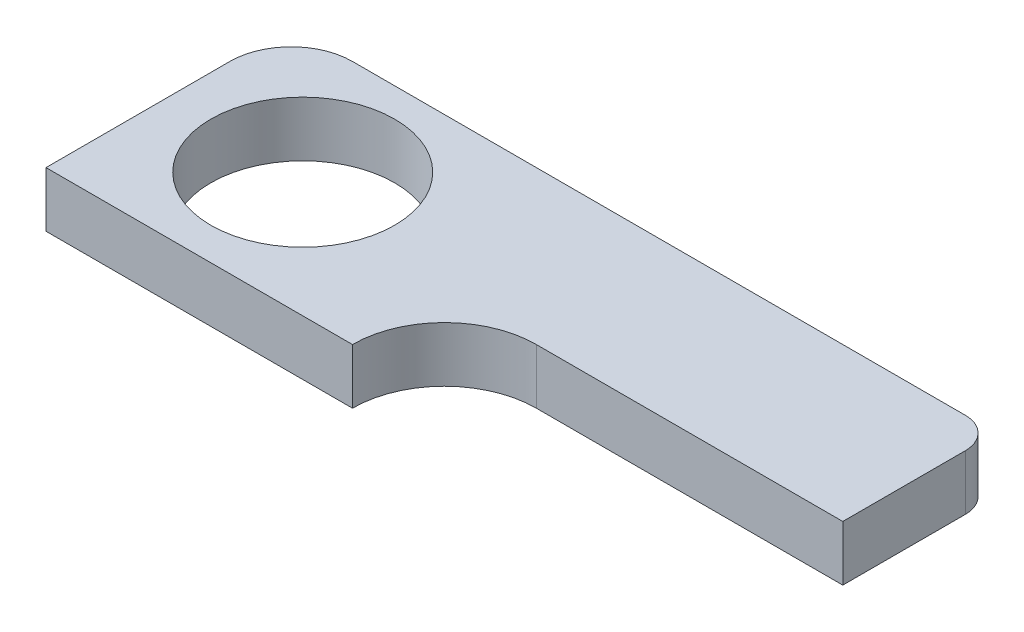
ISO-10303-21;
HEADER;
FILE_DESCRIPTION(('STEP AP214'),'2;1');
FILE_NAME('part.step','',(''),(''),'','','');
FILE_SCHEMA(('AUTOMOTIVE_DESIGN { 1 0 10303 214 1 1 1 1 }'));
ENDSEC;
DATA;
#1=APPLICATION_CONTEXT('core data for automotive mechanical design processes');
#2=APPLICATION_PROTOCOL_DEFINITION('international standard','automotive_design',2000,#1);
#3=PRODUCT_CONTEXT('',#1,'mechanical');
#4=PRODUCT('Part','Part','',(#3));
#5=PRODUCT_RELATED_PRODUCT_CATEGORY('part','',(#4));
#6=PRODUCT_DEFINITION_FORMATION('','',#4);
#7=PRODUCT_DEFINITION_CONTEXT('part definition',#1,'design');
#8=PRODUCT_DEFINITION('design','',#6,#7);
#9=PRODUCT_DEFINITION_SHAPE('','',#8);
#10=(LENGTH_UNIT() NAMED_UNIT(*) SI_UNIT(.MILLI.,.METRE.));
#11=(NAMED_UNIT(*) PLANE_ANGLE_UNIT() SI_UNIT($,.RADIAN.));
#12=(NAMED_UNIT(*) SI_UNIT($,.STERADIAN.) SOLID_ANGLE_UNIT());
#13=UNCERTAINTY_MEASURE_WITH_UNIT(LENGTH_MEASURE(1.E-05),#10,'distance_accuracy_value','');
#14=(GEOMETRIC_REPRESENTATION_CONTEXT(3) GLOBAL_UNCERTAINTY_ASSIGNED_CONTEXT((#13)) GLOBAL_UNIT_ASSIGNED_CONTEXT((#10,
#11,#12)) REPRESENTATION_CONTEXT('',''));
#15=CARTESIAN_POINT('',(0.,0.,0.));
#16=DIRECTION('',(0.,0.,1.));
#17=DIRECTION('',(1.,0.,0.));
#18=AXIS2_PLACEMENT_3D('',#15,#16,#17);
#19=CARTESIAN_POINT('',(220.,0.,-90.));
#20=DIRECTION('',(0.,1.,0.));
#21=DIRECTION('',(0.,0.,1.));
#22=AXIS2_PLACEMENT_3D('',#19,#20,#21);
#23=PLANE('',#22);
#24=CARTESIAN_POINT('',(43.1852937481381,0.,-60.5873975964926));
#25=DIRECTION('',(0.,-1.,0.));
#26=DIRECTION('',(0.,0.,-1.));
#27=AXIS2_PLACEMENT_3D('',#24,#25,#26);
#28=CIRCLE('',#27,30.);
#29=CARTESIAN_POINT('',(43.1852937481381,0.,-90.5873975964926));
#30=VERTEX_POINT('',#29);
#31=EDGE_CURVE('E109',#30,#30,#28,.F.);
#32=ORIENTED_EDGE('',*,*,#31,.T.);
#33=EDGE_LOOP('',(#32));
#34=FACE_BOUND('',#33,.T.);
#35=DIRECTION('',(-1.,0.,0.));
#36=VECTOR('',#35,1.);
#37=CARTESIAN_POINT('',(130.,0.,-50.));
#38=LINE('',#37,#36);
#39=CARTESIAN_POINT('',(230.,0.,-50.));
#40=VERTEX_POINT('',#39);
#41=CARTESIAN_POINT('',(130.,0.,-50.));
#42=VERTEX_POINT('',#41);
#43=EDGE_CURVE('E106',#40,#42,#38,.T.);
#44=ORIENTED_EDGE('',*,*,#43,.T.);
#45=CARTESIAN_POINT('',(130.,0.,-20.));
#46=DIRECTION('',(0.,-1.,0.));
#47=DIRECTION('',(0.,0.,-1.));
#48=AXIS2_PLACEMENT_3D('',#45,#46,#47);
#49=CIRCLE('',#48,30.);
#50=CARTESIAN_POINT('',(100.,0.,-19.9999999999998));
#51=VERTEX_POINT('',#50);
#52=EDGE_CURVE('E148',#42,#51,#49,.F.);
#53=ORIENTED_EDGE('',*,*,#52,.T.);
#54=DIRECTION('',(-1.,0.,0.));
#55=VECTOR('',#54,1.);
#56=CARTESIAN_POINT('',(100.,0.,-19.9999999999998));
#57=LINE('',#56,#55);
#58=CARTESIAN_POINT('',(0.,0.,-20.));
#59=VERTEX_POINT('',#58);
#60=EDGE_CURVE('E117',#51,#59,#57,.T.);
#61=ORIENTED_EDGE('',*,*,#60,.T.);
#62=DIRECTION('',(0.,0.,-1.));
#63=VECTOR('',#62,1.);
#64=CARTESIAN_POINT('',(0.,0.,-79.9999999999999));
#65=LINE('',#64,#63);
#66=CARTESIAN_POINT('',(0.,0.,-79.9999999999999));
#67=VERTEX_POINT('',#66);
#68=EDGE_CURVE('E125',#59,#67,#65,.T.);
#69=ORIENTED_EDGE('',*,*,#68,.T.);
#70=CARTESIAN_POINT('',(20.,0.,-80.));
#71=DIRECTION('',(0.,-1.,0.));
#72=DIRECTION('',(0.,0.,-1.));
#73=AXIS2_PLACEMENT_3D('',#70,#71,#72);
#74=CIRCLE('',#73,20.);
#75=CARTESIAN_POINT('',(20.,0.,-100.));
#76=VERTEX_POINT('',#75);
#77=EDGE_CURVE('E88',#76,#67,#74,.F.);
#78=ORIENTED_EDGE('',*,*,#77,.F.);
#79=DIRECTION('',(1.,0.,0.));
#80=VECTOR('',#79,1.);
#81=CARTESIAN_POINT('',(20.0000000000001,0.,-100.));
#82=LINE('',#81,#80);
#83=CARTESIAN_POINT('',(220.,0.,-100.));
#84=VERTEX_POINT('',#83);
#85=EDGE_CURVE('E85',#76,#84,#82,.T.);
#86=ORIENTED_EDGE('',*,*,#85,.T.);
#87=CARTESIAN_POINT('',(220.,0.,-90.));
#88=DIRECTION('',(0.,-1.,0.));
#89=DIRECTION('',(0.,0.,-1.));
#90=AXIS2_PLACEMENT_3D('',#87,#88,#89);
#91=CIRCLE('',#90,9.99999999999999);
#92=CARTESIAN_POINT('',(230.,0.,-90.));
#93=VERTEX_POINT('',#92);
#94=EDGE_CURVE('E19',#93,#84,#91,.F.);
#95=ORIENTED_EDGE('',*,*,#94,.F.);
#96=DIRECTION('',(0.,0.,1.));
#97=VECTOR('',#96,1.);
#98=CARTESIAN_POINT('',(230.,0.,-50.));
#99=LINE('',#98,#97);
#100=EDGE_CURVE('E83',#93,#40,#99,.T.);
#101=ORIENTED_EDGE('',*,*,#100,.T.);
#102=EDGE_LOOP('',(#44,#53,#61,#69,#78,#86,#95,#101));
#103=FACE_BOUND('',#102,.T.);
#104=ADVANCED_FACE('F16',(#34,#103),#23,.F.);
#105=CARTESIAN_POINT('',(230.,18.,-50.));
#106=DIRECTION('',(-1.,0.,0.));
#107=DIRECTION('',(0.,0.,1.));
#108=AXIS2_PLACEMENT_3D('',#105,#106,#107);
#109=PLANE('',#108);
#110=DIRECTION('',(0.,-1.,0.));
#111=VECTOR('',#110,1.);
#112=CARTESIAN_POINT('',(230.,18.,-89.9999999999999));
#113=LINE('',#112,#111);
#114=CARTESIAN_POINT('',(230.,18.,-90.));
#115=VERTEX_POINT('',#114);
#116=EDGE_CURVE('E81',#115,#93,#113,.T.);
#117=ORIENTED_EDGE('',*,*,#116,.F.);
#118=DIRECTION('',(0.,0.,1.));
#119=VECTOR('',#118,1.);
#120=CARTESIAN_POINT('',(230.,18.,-90.));
#121=LINE('',#120,#119);
#122=CARTESIAN_POINT('',(230.,18.,-50.));
#123=VERTEX_POINT('',#122);
#124=EDGE_CURVE('E144',#123,#115,#121,.F.);
#125=ORIENTED_EDGE('',*,*,#124,.F.);
#126=DIRECTION('',(0.,1.,0.));
#127=VECTOR('',#126,1.);
#128=CARTESIAN_POINT('',(230.,18.,-50.));
#129=LINE('',#128,#127);
#130=EDGE_CURVE('E110',#123,#40,#129,.F.);
#131=ORIENTED_EDGE('',*,*,#130,.T.);
#132=ORIENTED_EDGE('',*,*,#100,.F.);
#133=EDGE_LOOP('',(#117,#125,#131,#132));
#134=FACE_BOUND('',#133,.T.);
#135=ADVANCED_FACE('F203',(#134),#109,.F.);
#136=CARTESIAN_POINT('',(220.,18.,-90.));
#137=DIRECTION('',(0.,-1.,0.));
#138=DIRECTION('',(0.,0.,-1.));
#139=AXIS2_PLACEMENT_3D('',#136,#137,#138);
#140=CYLINDRICAL_SURFACE('',#139,9.99999999999999);
#141=CARTESIAN_POINT('',(220.,18.,-90.));
#142=DIRECTION('',(0.,-1.,0.));
#143=DIRECTION('',(0.,0.,-1.));
#144=AXIS2_PLACEMENT_3D('',#141,#142,#143);
#145=CIRCLE('',#144,9.99999999999999);
#146=CARTESIAN_POINT('',(220.,18.,-100.));
#147=VERTEX_POINT('',#146);
#148=EDGE_CURVE('E141',#115,#147,#145,.F.);
#149=ORIENTED_EDGE('',*,*,#148,.F.);
#150=ORIENTED_EDGE('',*,*,#116,.T.);
#151=ORIENTED_EDGE('',*,*,#94,.T.);
#152=DIRECTION('',(0.,1.,0.));
#153=VECTOR('',#152,1.);
#154=CARTESIAN_POINT('',(220.,18.,-100.));
#155=LINE('',#154,#153);
#156=EDGE_CURVE('E79',#84,#147,#155,.T.);
#157=ORIENTED_EDGE('',*,*,#156,.T.);
#158=EDGE_LOOP('',(#149,#150,#151,#157));
#159=FACE_BOUND('',#158,.T.);
#160=ADVANCED_FACE('F77',(#159),#140,.T.);
#161=CARTESIAN_POINT('',(20.0000000000001,18.,-100.));
#162=DIRECTION('',(0.,0.,1.));
#163=DIRECTION('',(1.,0.,0.));
#164=AXIS2_PLACEMENT_3D('',#161,#162,#163);
#165=PLANE('',#164);
#166=DIRECTION('',(0.,-1.,0.));
#167=VECTOR('',#166,1.);
#168=CARTESIAN_POINT('',(20.,18.,-100.));
#169=LINE('',#168,#167);
#170=CARTESIAN_POINT('',(20.,18.,-100.));
#171=VERTEX_POINT('',#170);
#172=EDGE_CURVE('E103',#171,#76,#169,.T.);
#173=ORIENTED_EDGE('',*,*,#172,.F.);
#174=DIRECTION('',(1.,0.,0.));
#175=VECTOR('',#174,1.);
#176=CARTESIAN_POINT('',(220.,18.,-100.));
#177=LINE('',#176,#175);
#178=EDGE_CURVE('E95',#147,#171,#177,.F.);
#179=ORIENTED_EDGE('',*,*,#178,.F.);
#180=ORIENTED_EDGE('',*,*,#156,.F.);
#181=ORIENTED_EDGE('',*,*,#85,.F.);
#182=EDGE_LOOP('',(#173,#179,#180,#181));
#183=FACE_BOUND('',#182,.T.);
#184=ADVANCED_FACE('F93',(#183),#165,.F.);
#185=CARTESIAN_POINT('',(20.,18.,-80.));
#186=DIRECTION('',(0.,-1.,0.));
#187=DIRECTION('',(0.,0.,-1.));
#188=AXIS2_PLACEMENT_3D('',#185,#186,#187);
#189=CYLINDRICAL_SURFACE('',#188,20.);
#190=CARTESIAN_POINT('',(20.,18.,-80.));
#191=DIRECTION('',(0.,-1.,0.));
#192=DIRECTION('',(0.,0.,-1.));
#193=AXIS2_PLACEMENT_3D('',#190,#191,#192);
#194=CIRCLE('',#193,20.);
#195=CARTESIAN_POINT('',(0.,18.,-79.9999999999999));
#196=VERTEX_POINT('',#195);
#197=EDGE_CURVE('E136',#171,#196,#194,.F.);
#198=ORIENTED_EDGE('',*,*,#197,.F.);
#199=ORIENTED_EDGE('',*,*,#172,.T.);
#200=ORIENTED_EDGE('',*,*,#77,.T.);
#201=DIRECTION('',(0.,1.,0.));
#202=VECTOR('',#201,1.);
#203=CARTESIAN_POINT('',(0.,18.,-79.9999999999999));
#204=LINE('',#203,#202);
#205=EDGE_CURVE('E128',#67,#196,#204,.T.);
#206=ORIENTED_EDGE('',*,*,#205,.T.);
#207=EDGE_LOOP('',(#198,#199,#200,#206));
#208=FACE_BOUND('',#207,.T.);
#209=ADVANCED_FACE('F214',(#208),#189,.T.);
#210=CARTESIAN_POINT('',(0.,18.,-79.9999999999999));
#211=DIRECTION('',(1.,0.,0.));
#212=DIRECTION('',(0.,0.,-1.));
#213=AXIS2_PLACEMENT_3D('',#210,#211,#212);
#214=PLANE('',#213);
#215=DIRECTION('',(0.,1.,0.));
#216=VECTOR('',#215,1.);
#217=CARTESIAN_POINT('',(0.,18.,-20.));
#218=LINE('',#217,#216);
#219=CARTESIAN_POINT('',(0.,18.,-20.));
#220=VERTEX_POINT('',#219);
#221=EDGE_CURVE('E122',#59,#220,#218,.T.);
#222=ORIENTED_EDGE('',*,*,#221,.T.);
#223=DIRECTION('',(0.,0.,1.));
#224=VECTOR('',#223,1.);
#225=CARTESIAN_POINT('',(0.,18.,-90.));
#226=LINE('',#225,#224);
#227=EDGE_CURVE('E140',#196,#220,#226,.T.);
#228=ORIENTED_EDGE('',*,*,#227,.F.);
#229=ORIENTED_EDGE('',*,*,#205,.F.);
#230=ORIENTED_EDGE('',*,*,#68,.F.);
#231=EDGE_LOOP('',(#222,#228,#229,#230));
#232=FACE_BOUND('',#231,.T.);
#233=ADVANCED_FACE('F210',(#232),#214,.F.);
#234=CARTESIAN_POINT('',(100.,18.,-19.9999999999998));
#235=DIRECTION('',(0.,0.,-1.));
#236=DIRECTION('',(-1.,0.,0.));
#237=AXIS2_PLACEMENT_3D('',#234,#235,#236);
#238=PLANE('',#237);
#239=DIRECTION('',(0.,-1.,0.));
#240=VECTOR('',#239,1.);
#241=CARTESIAN_POINT('',(100.,18.,-19.9999999999998));
#242=LINE('',#241,#240);
#243=CARTESIAN_POINT('',(100.,18.,-19.9999999999999));
#244=VERTEX_POINT('',#243);
#245=EDGE_CURVE('E121',#51,#244,#242,.F.);
#246=ORIENTED_EDGE('',*,*,#245,.T.);
#247=DIRECTION('',(1.,0.,0.));
#248=VECTOR('',#247,1.);
#249=CARTESIAN_POINT('',(220.,18.,-20.));
#250=LINE('',#249,#248);
#251=EDGE_CURVE('E135',#220,#244,#250,.T.);
#252=ORIENTED_EDGE('',*,*,#251,.F.);
#253=ORIENTED_EDGE('',*,*,#221,.F.);
#254=ORIENTED_EDGE('',*,*,#60,.F.);
#255=EDGE_LOOP('',(#246,#252,#253,#254));
#256=FACE_BOUND('',#255,.T.);
#257=ADVANCED_FACE('F212',(#256),#238,.F.);
#258=CARTESIAN_POINT('',(130.,18.,-20.));
#259=DIRECTION('',(0.,-1.,0.));
#260=DIRECTION('',(0.,0.,-1.));
#261=AXIS2_PLACEMENT_3D('',#258,#259,#260);
#262=CYLINDRICAL_SURFACE('',#261,30.);
#263=DIRECTION('',(0.,1.,0.));
#264=VECTOR('',#263,1.);
#265=CARTESIAN_POINT('',(130.,18.,-50.));
#266=LINE('',#265,#264);
#267=CARTESIAN_POINT('',(130.,18.,-50.));
#268=VERTEX_POINT('',#267);
#269=EDGE_CURVE('E35',#42,#268,#266,.T.);
#270=ORIENTED_EDGE('',*,*,#269,.T.);
#271=CARTESIAN_POINT('',(130.,18.,-20.));
#272=DIRECTION('',(0.,-1.,0.));
#273=DIRECTION('',(0.,0.,-1.));
#274=AXIS2_PLACEMENT_3D('',#271,#272,#273);
#275=CIRCLE('',#274,30.);
#276=EDGE_CURVE('E131',#244,#268,#275,.T.);
#277=ORIENTED_EDGE('',*,*,#276,.F.);
#278=ORIENTED_EDGE('',*,*,#245,.F.);
#279=ORIENTED_EDGE('',*,*,#52,.F.);
#280=EDGE_LOOP('',(#270,#277,#278,#279));
#281=FACE_BOUND('',#280,.T.);
#282=ADVANCED_FACE('F236',(#281),#262,.F.);
#283=CARTESIAN_POINT('',(130.,18.,-50.));
#284=DIRECTION('',(0.,0.,-1.));
#285=DIRECTION('',(-1.,0.,0.));
#286=AXIS2_PLACEMENT_3D('',#283,#284,#285);
#287=PLANE('',#286);
#288=ORIENTED_EDGE('',*,*,#130,.F.);
#289=DIRECTION('',(1.,0.,0.));
#290=VECTOR('',#289,1.);
#291=CARTESIAN_POINT('',(220.,18.,-50.));
#292=LINE('',#291,#290);
#293=EDGE_CURVE('E26',#268,#123,#292,.T.);
#294=ORIENTED_EDGE('',*,*,#293,.F.);
#295=ORIENTED_EDGE('',*,*,#269,.F.);
#296=ORIENTED_EDGE('',*,*,#43,.F.);
#297=EDGE_LOOP('',(#288,#294,#295,#296));
#298=FACE_BOUND('',#297,.T.);
#299=ADVANCED_FACE('F200',(#298),#287,.F.);
#300=CARTESIAN_POINT('',(43.1852937481381,18.,-60.5873975964926));
#301=DIRECTION('',(0.,-1.,0.));
#302=DIRECTION('',(0.,0.,-1.));
#303=AXIS2_PLACEMENT_3D('',#300,#301,#302);
#304=CYLINDRICAL_SURFACE('',#303,30.);
#305=CARTESIAN_POINT('',(43.1852937481381,18.,-60.5873975964926));
#306=DIRECTION('',(0.,-1.,0.));
#307=DIRECTION('',(0.,0.,-1.));
#308=AXIS2_PLACEMENT_3D('',#305,#306,#307);
#309=CIRCLE('',#308,30.);
#310=CARTESIAN_POINT('',(43.1852937481381,18.,-90.5873975964926));
#311=VERTEX_POINT('',#310);
#312=EDGE_CURVE('E11',#311,#311,#309,.T.);
#313=ORIENTED_EDGE('',*,*,#312,.F.);
#314=EDGE_LOOP('',(#313));
#315=FACE_BOUND('',#314,.T.);
#316=ORIENTED_EDGE('',*,*,#31,.F.);
#317=EDGE_LOOP('',(#316));
#318=FACE_BOUND('',#317,.T.);
#319=ADVANCED_FACE('F225',(#315,#318),#304,.F.);
#320=CARTESIAN_POINT('',(220.,18.,-90.));
#321=DIRECTION('',(0.,1.,0.));
#322=DIRECTION('',(0.,0.,1.));
#323=AXIS2_PLACEMENT_3D('',#320,#321,#322);
#324=PLANE('',#323);
#325=ORIENTED_EDGE('',*,*,#312,.T.);
#326=EDGE_LOOP('',(#325));
#327=FACE_BOUND('',#326,.T.);
#328=ORIENTED_EDGE('',*,*,#276,.T.);
#329=ORIENTED_EDGE('',*,*,#293,.T.);
#330=ORIENTED_EDGE('',*,*,#124,.T.);
#331=ORIENTED_EDGE('',*,*,#148,.T.);
#332=ORIENTED_EDGE('',*,*,#178,.T.);
#333=ORIENTED_EDGE('',*,*,#197,.T.);
#334=ORIENTED_EDGE('',*,*,#227,.T.);
#335=ORIENTED_EDGE('',*,*,#251,.T.);
#336=EDGE_LOOP('',(#328,#329,#330,#331,#332,#333,#334,#335));
#337=FACE_BOUND('',#336,.T.);
#338=ADVANCED_FACE('F195',(#327,#337),#324,.T.);
#339=CLOSED_SHELL('',(#104,#135,#160,#184,#209,#233,#257,#282,#299,#319,#338));
#340=MANIFOLD_SOLID_BREP('B1',#339);
#341=ADVANCED_BREP_SHAPE_REPRESENTATION('',(#18,#340),#14);
#342=SHAPE_DEFINITION_REPRESENTATION(#9,#341);
ENDSEC;
END-ISO-10303-21;
